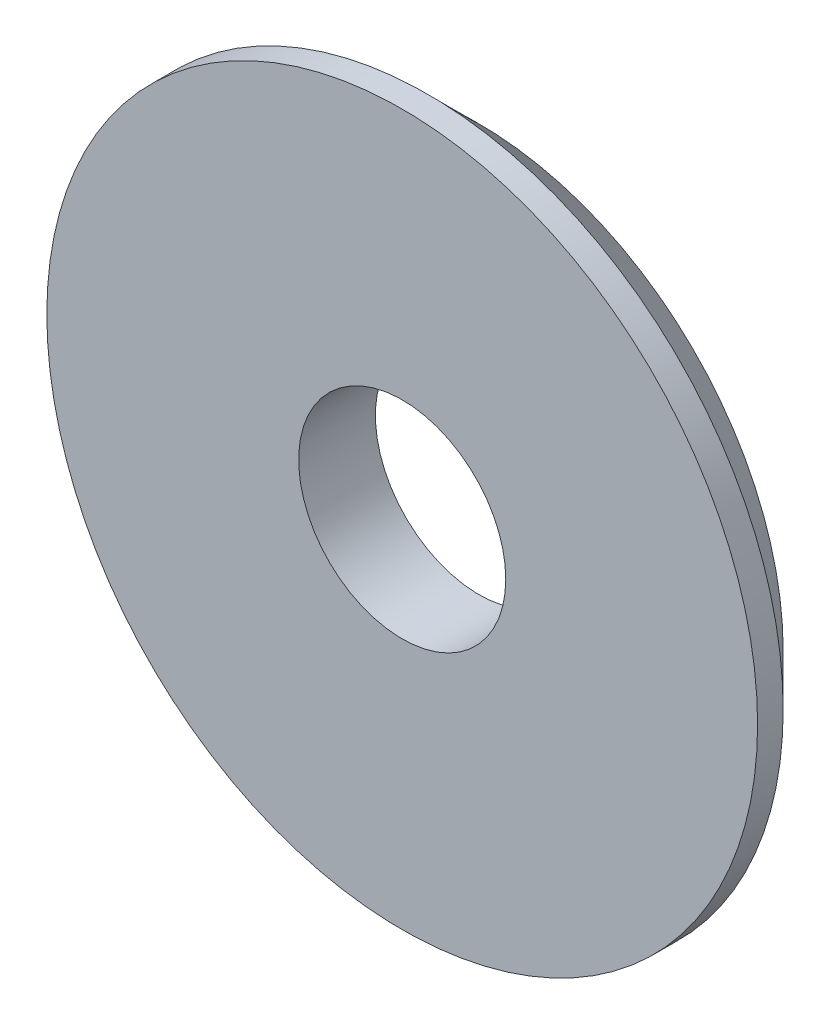
ISO-10303-21;
HEADER;
FILE_DESCRIPTION(('STEP AP214'),'2;1');
FILE_NAME('part.step','',(''),(''),'','','');
FILE_SCHEMA(('AUTOMOTIVE_DESIGN { 1 0 10303 214 1 1 1 1 }'));
ENDSEC;
DATA;
#1=APPLICATION_CONTEXT('core data for automotive mechanical design processes');
#2=APPLICATION_PROTOCOL_DEFINITION('international standard','automotive_design',2000,#1);
#3=PRODUCT_CONTEXT('',#1,'mechanical');
#4=PRODUCT('Part','Part','',(#3));
#5=PRODUCT_RELATED_PRODUCT_CATEGORY('part','',(#4));
#6=PRODUCT_DEFINITION_FORMATION('','',#4);
#7=PRODUCT_DEFINITION_CONTEXT('part definition',#1,'design');
#8=PRODUCT_DEFINITION('design','',#6,#7);
#9=PRODUCT_DEFINITION_SHAPE('','',#8);
#10=(LENGTH_UNIT() NAMED_UNIT(*) SI_UNIT(.MILLI.,.METRE.));
#11=(NAMED_UNIT(*) PLANE_ANGLE_UNIT() SI_UNIT($,.RADIAN.));
#12=(NAMED_UNIT(*) SI_UNIT($,.STERADIAN.) SOLID_ANGLE_UNIT());
#13=UNCERTAINTY_MEASURE_WITH_UNIT(LENGTH_MEASURE(1.E-05),#10,'distance_accuracy_value','');
#14=(GEOMETRIC_REPRESENTATION_CONTEXT(3) GLOBAL_UNCERTAINTY_ASSIGNED_CONTEXT((#13)) GLOBAL_UNIT_ASSIGNED_CONTEXT((#10,
#11,#12)) REPRESENTATION_CONTEXT('',''));
#15=CARTESIAN_POINT('',(0.,0.,0.));
#16=DIRECTION('',(0.,0.,1.));
#17=DIRECTION('',(1.,0.,0.));
#18=AXIS2_PLACEMENT_3D('',#15,#16,#17);
#19=CARTESIAN_POINT('',(0.,0.,3.));
#20=DIRECTION('',(0.,0.,1.));
#21=DIRECTION('',(1.,0.,0.));
#22=AXIS2_PLACEMENT_3D('',#19,#20,#21);
#23=PLANE('',#22);
#24=CARTESIAN_POINT('',(0.,0.,3.));
#25=DIRECTION('',(0.,0.,1.));
#26=DIRECTION('',(1.,0.,0.));
#27=AXIS2_PLACEMENT_3D('',#24,#25,#26);
#28=CIRCLE('',#27,13.9);
#29=CARTESIAN_POINT('',(13.9,0.,3.));
#30=VERTEX_POINT('',#29);
#31=EDGE_CURVE('E45',#30,#30,#28,.T.);
#32=ORIENTED_EDGE('',*,*,#31,.T.);
#33=EDGE_LOOP('',(#32));
#34=FACE_BOUND('',#33,.T.);
#35=CARTESIAN_POINT('',(0.,0.,3.));
#36=DIRECTION('',(0.,0.,1.));
#37=DIRECTION('',(1.,0.,0.));
#38=AXIS2_PLACEMENT_3D('',#35,#36,#37);
#39=CIRCLE('',#38,4.05);
#40=CARTESIAN_POINT('',(4.05,0.,3.));
#41=VERTEX_POINT('',#40);
#42=EDGE_CURVE('E49',#41,#41,#39,.T.);
#43=ORIENTED_EDGE('',*,*,#42,.F.);
#44=EDGE_LOOP('',(#43));
#45=FACE_BOUND('',#44,.T.);
#46=ADVANCED_FACE('F34',(#34,#45),#23,.T.);
#47=CARTESIAN_POINT('',(0.,0.,0.));
#48=DIRECTION('',(0.,0.,1.));
#49=DIRECTION('',(1.,0.,0.));
#50=AXIS2_PLACEMENT_3D('',#47,#48,#49);
#51=PLANE('',#50);
#52=CARTESIAN_POINT('',(0.,0.,0.));
#53=DIRECTION('',(0.,0.,1.));
#54=DIRECTION('',(1.,0.,0.));
#55=AXIS2_PLACEMENT_3D('',#52,#53,#54);
#56=CIRCLE('',#55,11.9);
#57=CARTESIAN_POINT('',(11.9,0.,0.));
#58=VERTEX_POINT('',#57);
#59=EDGE_CURVE('E10',#58,#58,#56,.F.);
#60=ORIENTED_EDGE('',*,*,#59,.T.);
#61=EDGE_LOOP('',(#60));
#62=FACE_BOUND('',#61,.T.);
#63=CARTESIAN_POINT('',(0.,0.,0.));
#64=DIRECTION('',(0.,0.,1.));
#65=DIRECTION('',(1.,0.,0.));
#66=AXIS2_PLACEMENT_3D('',#63,#64,#65);
#67=CIRCLE('',#66,4.05);
#68=CARTESIAN_POINT('',(4.05,0.,0.));
#69=VERTEX_POINT('',#68);
#70=EDGE_CURVE('E52',#69,#69,#67,.T.);
#71=ORIENTED_EDGE('',*,*,#70,.T.);
#72=EDGE_LOOP('',(#71));
#73=FACE_BOUND('',#72,.T.);
#74=ADVANCED_FACE('F62',(#62,#73),#51,.F.);
#75=CARTESIAN_POINT('',(0.,0.,3.));
#76=DIRECTION('',(0.,0.,-1.));
#77=DIRECTION('',(-1.,0.,0.));
#78=AXIS2_PLACEMENT_3D('',#75,#76,#77);
#79=CYLINDRICAL_SURFACE('',#78,13.9);
#80=CARTESIAN_POINT('',(0.,0.,2.));
#81=DIRECTION('',(0.,0.,1.));
#82=DIRECTION('',(1.,0.,0.));
#83=AXIS2_PLACEMENT_3D('',#80,#81,#82);
#84=CIRCLE('',#83,13.9);
#85=CARTESIAN_POINT('',(13.9,0.,2.));
#86=VERTEX_POINT('',#85);
#87=EDGE_CURVE('E41',#86,#86,#84,.T.);
#88=ORIENTED_EDGE('',*,*,#87,.T.);
#89=EDGE_LOOP('',(#88));
#90=FACE_BOUND('',#89,.T.);
#91=ORIENTED_EDGE('',*,*,#31,.F.);
#92=EDGE_LOOP('',(#91));
#93=FACE_BOUND('',#92,.T.);
#94=ADVANCED_FACE('F68',(#90,#93),#79,.T.);
#95=CARTESIAN_POINT('',(0.,0.,3.));
#96=DIRECTION('',(0.,0.,-1.));
#97=DIRECTION('',(-1.,0.,0.));
#98=AXIS2_PLACEMENT_3D('',#95,#96,#97);
#99=CYLINDRICAL_SURFACE('',#98,4.05);
#100=ORIENTED_EDGE('',*,*,#42,.T.);
#101=EDGE_LOOP('',(#100));
#102=FACE_BOUND('',#101,.T.);
#103=ORIENTED_EDGE('',*,*,#70,.F.);
#104=EDGE_LOOP('',(#103));
#105=FACE_BOUND('',#104,.T.);
#106=ADVANCED_FACE('F58',(#102,#105),#99,.F.);
#107=CARTESIAN_POINT('',(0.,0.,2.));
#108=DIRECTION('',(0.,0.,1.));
#109=DIRECTION('',(1.,0.,0.));
#110=AXIS2_PLACEMENT_3D('',#107,#108,#109);
#111=CONICAL_SURFACE('',#110,13.9,0.78539816339745);
#112=ORIENTED_EDGE('',*,*,#59,.F.);
#113=EDGE_LOOP('',(#112));
#114=FACE_BOUND('',#113,.T.);
#115=ORIENTED_EDGE('',*,*,#87,.F.);
#116=EDGE_LOOP('',(#115));
#117=FACE_BOUND('',#116,.T.);
#118=ADVANCED_FACE('F36',(#114,#117),#111,.T.);
#119=CLOSED_SHELL('',(#46,#74,#94,#106,#118));
#120=MANIFOLD_SOLID_BREP('B2',#119);
#121=ADVANCED_BREP_SHAPE_REPRESENTATION('',(#18,#120),#14);
#122=SHAPE_DEFINITION_REPRESENTATION(#9,#121);
ENDSEC;
END-ISO-10303-21;
